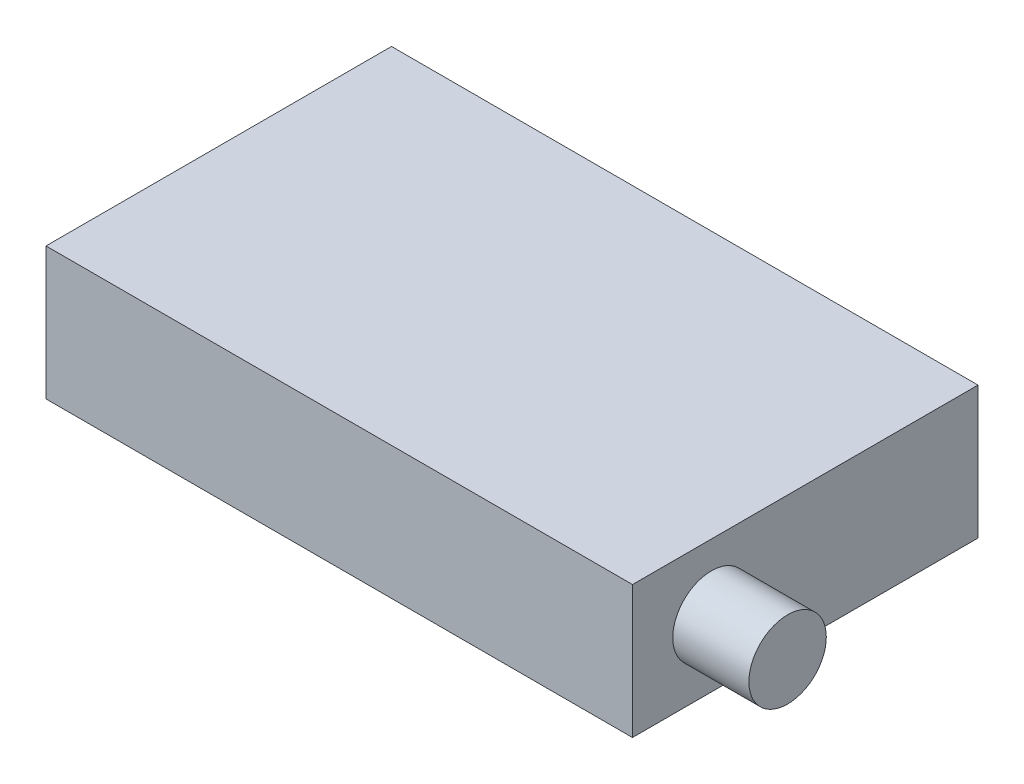
ISO-10303-21;
HEADER;
FILE_DESCRIPTION(('STEP AP214'),'2;1');
FILE_NAME('part.step','',(''),(''),'','','');
FILE_SCHEMA(('AUTOMOTIVE_DESIGN { 1 0 10303 214 1 1 1 1 }'));
ENDSEC;
DATA;
#1=APPLICATION_CONTEXT('core data for automotive mechanical design processes');
#2=APPLICATION_PROTOCOL_DEFINITION('international standard','automotive_design',2000,#1);
#3=PRODUCT_CONTEXT('',#1,'mechanical');
#4=PRODUCT('Part','Part','',(#3));
#5=PRODUCT_RELATED_PRODUCT_CATEGORY('part','',(#4));
#6=PRODUCT_DEFINITION_FORMATION('','',#4);
#7=PRODUCT_DEFINITION_CONTEXT('part definition',#1,'design');
#8=PRODUCT_DEFINITION('design','',#6,#7);
#9=PRODUCT_DEFINITION_SHAPE('','',#8);
#10=(LENGTH_UNIT() NAMED_UNIT(*) SI_UNIT(.MILLI.,.METRE.));
#11=(NAMED_UNIT(*) PLANE_ANGLE_UNIT() SI_UNIT($,.RADIAN.));
#12=(NAMED_UNIT(*) SI_UNIT($,.STERADIAN.) SOLID_ANGLE_UNIT());
#13=UNCERTAINTY_MEASURE_WITH_UNIT(LENGTH_MEASURE(1.E-05),#10,'distance_accuracy_value','');
#14=(GEOMETRIC_REPRESENTATION_CONTEXT(3) GLOBAL_UNCERTAINTY_ASSIGNED_CONTEXT((#13)) GLOBAL_UNIT_ASSIGNED_CONTEXT((#10,
#11,#12)) REPRESENTATION_CONTEXT('',''));
#15=CARTESIAN_POINT('',(0.,0.,0.));
#16=DIRECTION('',(0.,0.,1.));
#17=DIRECTION('',(1.,0.,0.));
#18=AXIS2_PLACEMENT_3D('',#15,#16,#17);
#19=CARTESIAN_POINT('',(-23.68,5.35,-13.95));
#20=DIRECTION('',(1.,0.,0.));
#21=DIRECTION('',(0.,0.,-1.));
#22=AXIS2_PLACEMENT_3D('',#19,#20,#21);
#23=PLANE('',#22);
#24=DIRECTION('',(0.,0.,-1.));
#25=VECTOR('',#24,1.);
#26=CARTESIAN_POINT('',(-23.68,0.95,-10.25));
#27=LINE('',#26,#25);
#28=CARTESIAN_POINT('',(-23.68,0.95,9.85));
#29=VERTEX_POINT('',#28);
#30=CARTESIAN_POINT('',(-23.68,0.95,-10.25));
#31=VERTEX_POINT('',#30);
#32=EDGE_CURVE('E159',#29,#31,#27,.T.);
#33=ORIENTED_EDGE('',*,*,#32,.F.);
#34=DIRECTION('',(0.,1.,0.));
#35=VECTOR('',#34,1.);
#36=CARTESIAN_POINT('',(-23.68,0.95,9.85));
#37=LINE('',#36,#35);
#38=CARTESIAN_POINT('',(-23.68,-2.25,9.85));
#39=VERTEX_POINT('',#38);
#40=EDGE_CURVE('E129',#39,#29,#37,.T.);
#41=ORIENTED_EDGE('',*,*,#40,.F.);
#42=DIRECTION('',(0.,0.,1.));
#43=VECTOR('',#42,1.);
#44=CARTESIAN_POINT('',(-23.68,-2.25,0.950000000000002));
#45=LINE('',#44,#43);
#46=CARTESIAN_POINT('',(-23.68,-2.25,0.950000000000002));
#47=VERTEX_POINT('',#46);
#48=EDGE_CURVE('E229',#47,#39,#45,.T.);
#49=ORIENTED_EDGE('',*,*,#48,.F.);
#50=DIRECTION('',(0.,1.,0.));
#51=VECTOR('',#50,1.);
#52=CARTESIAN_POINT('',(-23.68,0.95,0.950000000000001));
#53=LINE('',#52,#51);
#54=CARTESIAN_POINT('',(-23.68,-4.05,0.950000000000002));
#55=VERTEX_POINT('',#54);
#56=EDGE_CURVE('E138',#55,#47,#53,.T.);
#57=ORIENTED_EDGE('',*,*,#56,.F.);
#58=DIRECTION('',(0.,0.,1.));
#59=VECTOR('',#58,1.);
#60=CARTESIAN_POINT('',(-23.68,-4.05,-10.25));
#61=LINE('',#60,#59);
#62=CARTESIAN_POINT('',(-23.68,-4.05,-10.25));
#63=VERTEX_POINT('',#62);
#64=EDGE_CURVE('E154',#63,#55,#61,.T.);
#65=ORIENTED_EDGE('',*,*,#64,.F.);
#66=DIRECTION('',(0.,-1.,0.));
#67=VECTOR('',#66,1.);
#68=CARTESIAN_POINT('',(-23.68,0.95,-10.25));
#69=LINE('',#68,#67);
#70=EDGE_CURVE('E46',#31,#63,#69,.T.);
#71=ORIENTED_EDGE('',*,*,#70,.F.);
#72=EDGE_LOOP('',(#33,#41,#49,#57,#65,#71));
#73=FACE_BOUND('',#72,.T.);
#74=DIRECTION('',(0.,0.,1.));
#75=VECTOR('',#74,1.);
#76=CARTESIAN_POINT('',(-23.68,-5.35,-13.95));
#77=LINE('',#76,#75);
#78=CARTESIAN_POINT('',(-23.68,-5.35,-13.95));
#79=VERTEX_POINT('',#78);
#80=CARTESIAN_POINT('',(-23.68,-5.35,13.95));
#81=VERTEX_POINT('',#80);
#82=EDGE_CURVE('E170',#79,#81,#77,.T.);
#83=ORIENTED_EDGE('',*,*,#82,.T.);
#84=DIRECTION('',(0.,-1.,0.));
#85=VECTOR('',#84,1.);
#86=CARTESIAN_POINT('',(-23.68,5.35,13.95));
#87=LINE('',#86,#85);
#88=CARTESIAN_POINT('',(-23.68,5.35,13.95));
#89=VERTEX_POINT('',#88);
#90=EDGE_CURVE('E39',#89,#81,#87,.T.);
#91=ORIENTED_EDGE('',*,*,#90,.F.);
#92=DIRECTION('',(0.,0.,1.));
#93=VECTOR('',#92,1.);
#94=CARTESIAN_POINT('',(-23.68,5.35,-13.95));
#95=LINE('',#94,#93);
#96=CARTESIAN_POINT('',(-23.68,5.35,-13.95));
#97=VERTEX_POINT('',#96);
#98=EDGE_CURVE('E171',#97,#89,#95,.T.);
#99=ORIENTED_EDGE('',*,*,#98,.F.);
#100=DIRECTION('',(0.,-1.,0.));
#101=VECTOR('',#100,1.);
#102=CARTESIAN_POINT('',(-23.68,5.35,-13.95));
#103=LINE('',#102,#101);
#104=EDGE_CURVE('E177',#97,#79,#103,.T.);
#105=ORIENTED_EDGE('',*,*,#104,.T.);
#106=EDGE_LOOP('',(#83,#91,#99,#105));
#107=FACE_BOUND('',#106,.T.);
#108=ADVANCED_FACE('F32',(#73,#107),#23,.F.);
#109=CARTESIAN_POINT('',(-23.68,5.35,13.95));
#110=DIRECTION('',(0.,0.,-1.));
#111=DIRECTION('',(-1.,0.,0.));
#112=AXIS2_PLACEMENT_3D('',#109,#110,#111);
#113=PLANE('',#112);
#114=DIRECTION('',(1.,0.,0.));
#115=VECTOR('',#114,1.);
#116=CARTESIAN_POINT('',(-23.68,-5.35,13.95));
#117=LINE('',#116,#115);
#118=CARTESIAN_POINT('',(23.68,-5.35,13.95));
#119=VERTEX_POINT('',#118);
#120=EDGE_CURVE('E180',#81,#119,#117,.T.);
#121=ORIENTED_EDGE('',*,*,#120,.T.);
#122=DIRECTION('',(0.,-1.,0.));
#123=VECTOR('',#122,1.);
#124=CARTESIAN_POINT('',(23.68,5.35,13.95));
#125=LINE('',#124,#123);
#126=CARTESIAN_POINT('',(23.68,5.35,13.95));
#127=VERTEX_POINT('',#126);
#128=EDGE_CURVE('E188',#127,#119,#125,.T.);
#129=ORIENTED_EDGE('',*,*,#128,.F.);
#130=DIRECTION('',(1.,0.,0.));
#131=VECTOR('',#130,1.);
#132=CARTESIAN_POINT('',(-23.68,5.35,13.95));
#133=LINE('',#132,#131);
#134=EDGE_CURVE('E84',#89,#127,#133,.T.);
#135=ORIENTED_EDGE('',*,*,#134,.F.);
#136=ORIENTED_EDGE('',*,*,#90,.T.);
#137=EDGE_LOOP('',(#121,#129,#135,#136));
#138=FACE_BOUND('',#137,.T.);
#139=ADVANCED_FACE('F191',(#138),#113,.F.);
#140=CARTESIAN_POINT('',(23.68,5.35,-13.95));
#141=DIRECTION('',(-1.,0.,0.));
#142=DIRECTION('',(0.,0.,1.));
#143=AXIS2_PLACEMENT_3D('',#140,#141,#142);
#144=PLANE('',#143);
#145=CARTESIAN_POINT('',(23.68,0.,7.575));
#146=DIRECTION('',(-1.,0.,0.));
#147=DIRECTION('',(0.,0.,1.));
#148=AXIS2_PLACEMENT_3D('',#145,#146,#147);
#149=CIRCLE('',#148,3.125);
#150=CARTESIAN_POINT('',(23.68,0.,10.7));
#151=VERTEX_POINT('',#150);
#152=EDGE_CURVE('E11',#151,#151,#149,.F.);
#153=ORIENTED_EDGE('',*,*,#152,.F.);
#154=EDGE_LOOP('',(#153));
#155=FACE_BOUND('',#154,.T.);
#156=DIRECTION('',(0.,0.,-1.));
#157=VECTOR('',#156,1.);
#158=CARTESIAN_POINT('',(23.68,-5.35,-13.95));
#159=LINE('',#158,#157);
#160=CARTESIAN_POINT('',(23.68,-5.35,-13.95));
#161=VERTEX_POINT('',#160);
#162=EDGE_CURVE('E182',#119,#161,#159,.T.);
#163=ORIENTED_EDGE('',*,*,#162,.T.);
#164=DIRECTION('',(0.,-1.,0.));
#165=VECTOR('',#164,1.);
#166=CARTESIAN_POINT('',(23.68,5.35,-13.95));
#167=LINE('',#166,#165);
#168=CARTESIAN_POINT('',(23.68,5.35,-13.95));
#169=VERTEX_POINT('',#168);
#170=EDGE_CURVE('E186',#169,#161,#167,.T.);
#171=ORIENTED_EDGE('',*,*,#170,.F.);
#172=DIRECTION('',(0.,0.,-1.));
#173=VECTOR('',#172,1.);
#174=CARTESIAN_POINT('',(23.68,5.35,-13.95));
#175=LINE('',#174,#173);
#176=EDGE_CURVE('E174',#127,#169,#175,.T.);
#177=ORIENTED_EDGE('',*,*,#176,.F.);
#178=ORIENTED_EDGE('',*,*,#128,.T.);
#179=EDGE_LOOP('',(#163,#171,#177,#178));
#180=FACE_BOUND('',#179,.T.);
#181=ADVANCED_FACE('F200',(#155,#180),#144,.F.);
#182=CARTESIAN_POINT('',(-23.68,5.35,-13.95));
#183=DIRECTION('',(0.,0.,1.));
#184=DIRECTION('',(1.,0.,0.));
#185=AXIS2_PLACEMENT_3D('',#182,#183,#184);
#186=PLANE('',#185);
#187=DIRECTION('',(-1.,0.,0.));
#188=VECTOR('',#187,1.);
#189=CARTESIAN_POINT('',(-23.68,-5.35,-13.95));
#190=LINE('',#189,#188);
#191=EDGE_CURVE('E76',#161,#79,#190,.T.);
#192=ORIENTED_EDGE('',*,*,#191,.T.);
#193=ORIENTED_EDGE('',*,*,#104,.F.);
#194=DIRECTION('',(-1.,0.,0.));
#195=VECTOR('',#194,1.);
#196=CARTESIAN_POINT('',(-23.68,5.35,-13.95));
#197=LINE('',#196,#195);
#198=EDGE_CURVE('E55',#169,#97,#197,.T.);
#199=ORIENTED_EDGE('',*,*,#198,.F.);
#200=ORIENTED_EDGE('',*,*,#170,.T.);
#201=EDGE_LOOP('',(#192,#193,#199,#200));
#202=FACE_BOUND('',#201,.T.);
#203=ADVANCED_FACE('F202',(#202),#186,.F.);
#204=CARTESIAN_POINT('',(0.,5.35,0.));
#205=DIRECTION('',(0.,1.,0.));
#206=DIRECTION('',(0.,0.,1.));
#207=AXIS2_PLACEMENT_3D('',#204,#205,#206);
#208=PLANE('',#207);
#209=ORIENTED_EDGE('',*,*,#98,.T.);
#210=ORIENTED_EDGE('',*,*,#134,.T.);
#211=ORIENTED_EDGE('',*,*,#176,.T.);
#212=ORIENTED_EDGE('',*,*,#198,.T.);
#213=EDGE_LOOP('',(#209,#210,#211,#212));
#214=FACE_BOUND('',#213,.T.);
#215=ADVANCED_FACE('F203',(#214),#208,.T.);
#216=CARTESIAN_POINT('',(0.,-5.35,0.));
#217=DIRECTION('',(0.,1.,0.));
#218=DIRECTION('',(0.,0.,1.));
#219=AXIS2_PLACEMENT_3D('',#216,#217,#218);
#220=PLANE('',#219);
#221=ORIENTED_EDGE('',*,*,#82,.F.);
#222=ORIENTED_EDGE('',*,*,#191,.F.);
#223=ORIENTED_EDGE('',*,*,#162,.F.);
#224=ORIENTED_EDGE('',*,*,#120,.F.);
#225=EDGE_LOOP('',(#221,#222,#223,#224));
#226=FACE_BOUND('',#225,.T.);
#227=ADVANCED_FACE('F196',(#226),#220,.F.);
#228=CARTESIAN_POINT('',(29.83,0.,7.575));
#229=DIRECTION('',(-1.,0.,0.));
#230=DIRECTION('',(0.,0.,1.));
#231=AXIS2_PLACEMENT_3D('',#228,#229,#230);
#232=CYLINDRICAL_SURFACE('',#231,3.125);
#233=CARTESIAN_POINT('',(29.83,0.,7.575));
#234=DIRECTION('',(1.,0.,0.));
#235=DIRECTION('',(0.,0.,-1.));
#236=AXIS2_PLACEMENT_3D('',#233,#234,#235);
#237=CIRCLE('',#236,3.125);
#238=CARTESIAN_POINT('',(29.83,0.,4.45));
#239=VERTEX_POINT('',#238);
#240=EDGE_CURVE('E164',#239,#239,#237,.T.);
#241=ORIENTED_EDGE('',*,*,#240,.F.);
#242=EDGE_LOOP('',(#241));
#243=FACE_BOUND('',#242,.T.);
#244=ORIENTED_EDGE('',*,*,#152,.T.);
#245=EDGE_LOOP('',(#244));
#246=FACE_BOUND('',#245,.T.);
#247=ADVANCED_FACE('F210',(#243,#246),#232,.T.);
#248=CARTESIAN_POINT('',(29.83,0.,7.575));
#249=DIRECTION('',(1.,0.,0.));
#250=DIRECTION('',(0.,0.,-1.));
#251=AXIS2_PLACEMENT_3D('',#248,#249,#250);
#252=PLANE('',#251);
#253=ORIENTED_EDGE('',*,*,#240,.T.);
#254=EDGE_LOOP('',(#253));
#255=FACE_BOUND('',#254,.T.);
#256=ADVANCED_FACE('F250',(#255),#252,.T.);
#257=CARTESIAN_POINT('',(-22.68,0.95,-10.25));
#258=DIRECTION('',(0.,0.,-1.));
#259=DIRECTION('',(-1.,0.,0.));
#260=AXIS2_PLACEMENT_3D('',#257,#258,#259);
#261=PLANE('',#260);
#262=ORIENTED_EDGE('',*,*,#70,.T.);
#263=DIRECTION('',(-1.,0.,0.));
#264=VECTOR('',#263,1.);
#265=CARTESIAN_POINT('',(-22.68,-4.05,-10.25));
#266=LINE('',#265,#264);
#267=CARTESIAN_POINT('',(-22.68,-4.05,-10.25));
#268=VERTEX_POINT('',#267);
#269=EDGE_CURVE('E147',#268,#63,#266,.T.);
#270=ORIENTED_EDGE('',*,*,#269,.F.);
#271=DIRECTION('',(0.,-1.,0.));
#272=VECTOR('',#271,1.);
#273=CARTESIAN_POINT('',(-22.68,0.95,-10.25));
#274=LINE('',#273,#272);
#275=CARTESIAN_POINT('',(-22.68,0.95,-10.25));
#276=VERTEX_POINT('',#275);
#277=EDGE_CURVE('E149',#276,#268,#274,.T.);
#278=ORIENTED_EDGE('',*,*,#277,.F.);
#279=DIRECTION('',(-1.,0.,0.));
#280=VECTOR('',#279,1.);
#281=CARTESIAN_POINT('',(-22.68,0.95,-10.25));
#282=LINE('',#281,#280);
#283=EDGE_CURVE('E162',#276,#31,#282,.T.);
#284=ORIENTED_EDGE('',*,*,#283,.T.);
#285=EDGE_LOOP('',(#262,#270,#278,#284));
#286=FACE_BOUND('',#285,.T.);
#287=ADVANCED_FACE('F235',(#286),#261,.F.);
#288=CARTESIAN_POINT('',(-22.68,0.95,-10.25));
#289=DIRECTION('',(0.,1.,0.));
#290=DIRECTION('',(0.,0.,1.));
#291=AXIS2_PLACEMENT_3D('',#288,#289,#290);
#292=PLANE('',#291);
#293=ORIENTED_EDGE('',*,*,#32,.T.);
#294=ORIENTED_EDGE('',*,*,#283,.F.);
#295=DIRECTION('',(0.,0.,-1.));
#296=VECTOR('',#295,1.);
#297=CARTESIAN_POINT('',(-22.68,0.95,-10.25));
#298=LINE('',#297,#296);
#299=CARTESIAN_POINT('',(-22.68,0.95,9.85));
#300=VERTEX_POINT('',#299);
#301=EDGE_CURVE('E144',#300,#276,#298,.T.);
#302=ORIENTED_EDGE('',*,*,#301,.F.);
#303=DIRECTION('',(-1.,0.,0.));
#304=VECTOR('',#303,1.);
#305=CARTESIAN_POINT('',(-22.68,0.95,9.85));
#306=LINE('',#305,#304);
#307=EDGE_CURVE('E155',#300,#29,#306,.T.);
#308=ORIENTED_EDGE('',*,*,#307,.T.);
#309=EDGE_LOOP('',(#293,#294,#302,#308));
#310=FACE_BOUND('',#309,.T.);
#311=ADVANCED_FACE('F225',(#310),#292,.F.);
#312=CARTESIAN_POINT('',(-22.68,0.95,0.950000000000001));
#313=DIRECTION('',(0.,0.,1.));
#314=DIRECTION('',(0.,-1.,0.));
#315=AXIS2_PLACEMENT_3D('',#312,#313,#314);
#316=PLANE('',#315);
#317=ORIENTED_EDGE('',*,*,#56,.T.);
#318=DIRECTION('',(-1.,0.,0.));
#319=VECTOR('',#318,1.);
#320=CARTESIAN_POINT('',(-22.68,-2.25,0.950000000000002));
#321=LINE('',#320,#319);
#322=CARTESIAN_POINT('',(-22.68,-2.25,0.950000000000002));
#323=VERTEX_POINT('',#322);
#324=EDGE_CURVE('E121',#323,#47,#321,.T.);
#325=ORIENTED_EDGE('',*,*,#324,.F.);
#326=DIRECTION('',(0.,1.,0.));
#327=VECTOR('',#326,1.);
#328=CARTESIAN_POINT('',(-22.68,0.95,0.950000000000001));
#329=LINE('',#328,#327);
#330=CARTESIAN_POINT('',(-22.68,-4.05,0.950000000000002));
#331=VERTEX_POINT('',#330);
#332=EDGE_CURVE('E135',#331,#323,#329,.T.);
#333=ORIENTED_EDGE('',*,*,#332,.F.);
#334=DIRECTION('',(-1.,0.,0.));
#335=VECTOR('',#334,1.);
#336=CARTESIAN_POINT('',(-22.68,-4.05,0.950000000000002));
#337=LINE('',#336,#335);
#338=EDGE_CURVE('E165',#331,#55,#337,.T.);
#339=ORIENTED_EDGE('',*,*,#338,.T.);
#340=EDGE_LOOP('',(#317,#325,#333,#339));
#341=FACE_BOUND('',#340,.T.);
#342=ADVANCED_FACE('F134',(#341),#316,.F.);
#343=CARTESIAN_POINT('',(-22.68,-4.05,-10.25));
#344=DIRECTION('',(0.,-1.,0.));
#345=DIRECTION('',(0.,0.,-1.));
#346=AXIS2_PLACEMENT_3D('',#343,#344,#345);
#347=PLANE('',#346);
#348=ORIENTED_EDGE('',*,*,#64,.T.);
#349=ORIENTED_EDGE('',*,*,#338,.F.);
#350=DIRECTION('',(0.,0.,1.));
#351=VECTOR('',#350,1.);
#352=CARTESIAN_POINT('',(-22.68,-4.05,-10.25));
#353=LINE('',#352,#351);
#354=EDGE_CURVE('E143',#268,#331,#353,.T.);
#355=ORIENTED_EDGE('',*,*,#354,.F.);
#356=ORIENTED_EDGE('',*,*,#269,.T.);
#357=EDGE_LOOP('',(#348,#349,#355,#356));
#358=FACE_BOUND('',#357,.T.);
#359=ADVANCED_FACE('F237',(#358),#347,.F.);
#360=CARTESIAN_POINT('',(-22.68,0.,0.));
#361=DIRECTION('',(-1.,0.,0.));
#362=DIRECTION('',(0.,0.,1.));
#363=AXIS2_PLACEMENT_3D('',#360,#361,#362);
#364=PLANE('',#363);
#365=ORIENTED_EDGE('',*,*,#277,.T.);
#366=ORIENTED_EDGE('',*,*,#354,.T.);
#367=ORIENTED_EDGE('',*,*,#332,.T.);
#368=DIRECTION('',(0.,0.,1.));
#369=VECTOR('',#368,1.);
#370=CARTESIAN_POINT('',(-22.68,-2.25,0.950000000000002));
#371=LINE('',#370,#369);
#372=CARTESIAN_POINT('',(-22.68,-2.25,9.85));
#373=VERTEX_POINT('',#372);
#374=EDGE_CURVE('E117',#323,#373,#371,.T.);
#375=ORIENTED_EDGE('',*,*,#374,.T.);
#376=DIRECTION('',(0.,1.,0.));
#377=VECTOR('',#376,1.);
#378=CARTESIAN_POINT('',(-22.68,0.95,9.85));
#379=LINE('',#378,#377);
#380=EDGE_CURVE('E128',#373,#300,#379,.T.);
#381=ORIENTED_EDGE('',*,*,#380,.T.);
#382=ORIENTED_EDGE('',*,*,#301,.T.);
#383=EDGE_LOOP('',(#365,#366,#367,#375,#381,#382));
#384=FACE_BOUND('',#383,.T.);
#385=ADVANCED_FACE('F141',(#384),#364,.T.);
#386=CARTESIAN_POINT('',(-22.68,0.95,9.85));
#387=DIRECTION('',(0.,0.,1.));
#388=DIRECTION('',(1.,0.,0.));
#389=AXIS2_PLACEMENT_3D('',#386,#387,#388);
#390=PLANE('',#389);
#391=ORIENTED_EDGE('',*,*,#40,.T.);
#392=ORIENTED_EDGE('',*,*,#307,.F.);
#393=ORIENTED_EDGE('',*,*,#380,.F.);
#394=DIRECTION('',(-1.,0.,0.));
#395=VECTOR('',#394,1.);
#396=CARTESIAN_POINT('',(-22.68,-2.25,9.85));
#397=LINE('',#396,#395);
#398=EDGE_CURVE('E123',#373,#39,#397,.T.);
#399=ORIENTED_EDGE('',*,*,#398,.T.);
#400=EDGE_LOOP('',(#391,#392,#393,#399));
#401=FACE_BOUND('',#400,.T.);
#402=ADVANCED_FACE('F228',(#401),#390,.F.);
#403=CARTESIAN_POINT('',(-22.68,-2.25,0.950000000000002));
#404=DIRECTION('',(0.,-1.,0.));
#405=DIRECTION('',(0.,0.,-1.));
#406=AXIS2_PLACEMENT_3D('',#403,#404,#405);
#407=PLANE('',#406);
#408=ORIENTED_EDGE('',*,*,#48,.T.);
#409=ORIENTED_EDGE('',*,*,#398,.F.);
#410=ORIENTED_EDGE('',*,*,#374,.F.);
#411=ORIENTED_EDGE('',*,*,#324,.T.);
#412=EDGE_LOOP('',(#408,#409,#410,#411));
#413=FACE_BOUND('',#412,.T.);
#414=ADVANCED_FACE('F120',(#413),#407,.F.);
#415=CLOSED_SHELL('',(#108,#139,#181,#203,#215,#227,#247,#256,#287,#311,#342,#359,#385,#402,#414));
#416=MANIFOLD_SOLID_BREP('B2',#415);
#417=ADVANCED_BREP_SHAPE_REPRESENTATION('',(#18,#416),#14);
#418=SHAPE_DEFINITION_REPRESENTATION(#9,#417);
ENDSEC;
END-ISO-10303-21;
